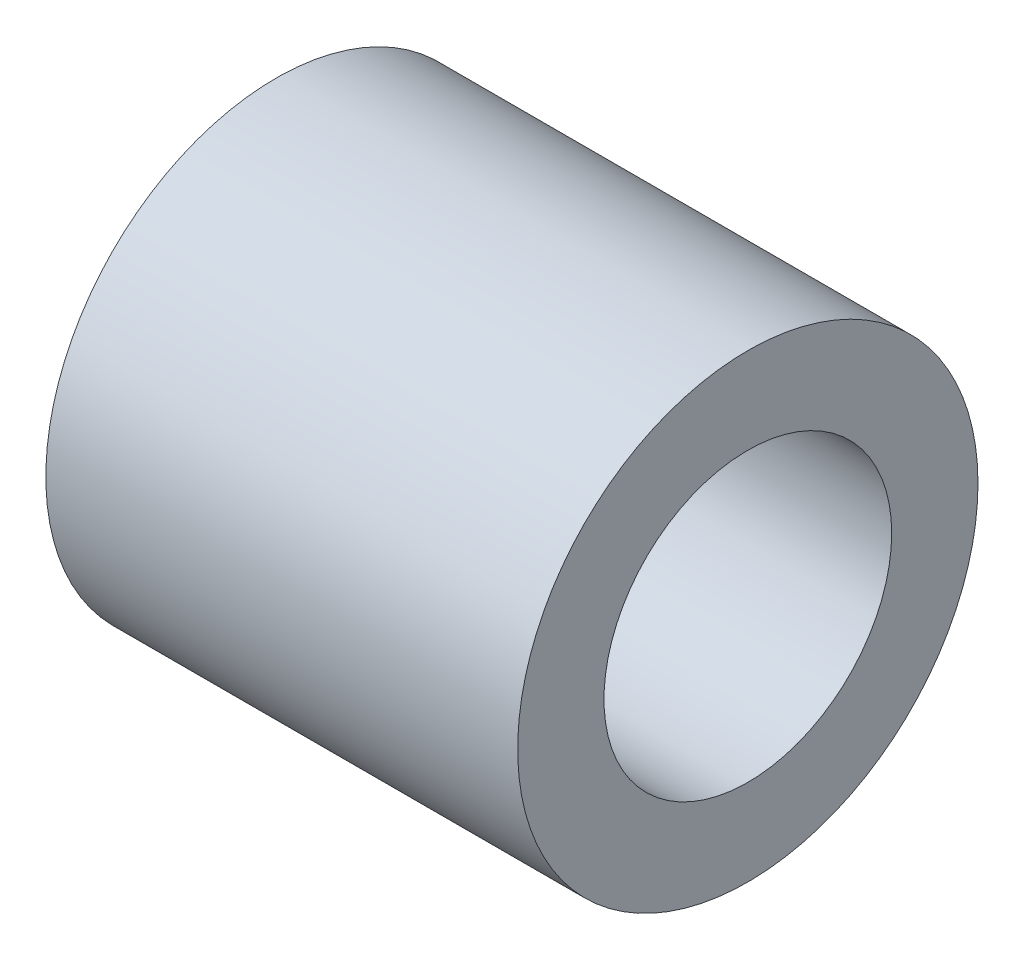
ISO-10303-21;
HEADER;
FILE_DESCRIPTION(('STEP AP214'),'2;1');
FILE_NAME('part.step','',(''),(''),'','','');
FILE_SCHEMA(('AUTOMOTIVE_DESIGN { 1 0 10303 214 1 1 1 1 }'));
ENDSEC;
DATA;
#1=APPLICATION_CONTEXT('core data for automotive mechanical design processes');
#2=APPLICATION_PROTOCOL_DEFINITION('international standard','automotive_design',2000,#1);
#3=PRODUCT_CONTEXT('',#1,'mechanical');
#4=PRODUCT('Part','Part','',(#3));
#5=PRODUCT_RELATED_PRODUCT_CATEGORY('part','',(#4));
#6=PRODUCT_DEFINITION_FORMATION('','',#4);
#7=PRODUCT_DEFINITION_CONTEXT('part definition',#1,'design');
#8=PRODUCT_DEFINITION('design','',#6,#7);
#9=PRODUCT_DEFINITION_SHAPE('','',#8);
#10=(LENGTH_UNIT() NAMED_UNIT(*) SI_UNIT(.MILLI.,.METRE.));
#11=(NAMED_UNIT(*) PLANE_ANGLE_UNIT() SI_UNIT($,.RADIAN.));
#12=(NAMED_UNIT(*) SI_UNIT($,.STERADIAN.) SOLID_ANGLE_UNIT());
#13=UNCERTAINTY_MEASURE_WITH_UNIT(LENGTH_MEASURE(1.E-05),#10,'distance_accuracy_value','');
#14=(GEOMETRIC_REPRESENTATION_CONTEXT(3) GLOBAL_UNCERTAINTY_ASSIGNED_CONTEXT((#13)) GLOBAL_UNIT_ASSIGNED_CONTEXT((#10,
#11,#12)) REPRESENTATION_CONTEXT('',''));
#15=CARTESIAN_POINT('',(0.,0.,0.));
#16=DIRECTION('',(0.,0.,1.));
#17=DIRECTION('',(1.,0.,0.));
#18=AXIS2_PLACEMENT_3D('',#15,#16,#17);
#19=CARTESIAN_POINT('',(8.2,0.,0.));
#20=DIRECTION('',(-1.,0.,0.));
#21=DIRECTION('',(0.,0.,1.));
#22=AXIS2_PLACEMENT_3D('',#19,#20,#21);
#23=CYLINDRICAL_SURFACE('',#22,2.5);
#24=CARTESIAN_POINT('',(8.2,0.,0.));
#25=DIRECTION('',(1.,0.,0.));
#26=DIRECTION('',(0.,0.,-1.));
#27=AXIS2_PLACEMENT_3D('',#24,#25,#26);
#28=CIRCLE('',#27,2.5);
#29=CARTESIAN_POINT('',(8.2,0.,-2.5));
#30=VERTEX_POINT('',#29);
#31=EDGE_CURVE('E45',#30,#30,#28,.T.);
#32=ORIENTED_EDGE('',*,*,#31,.T.);
#33=EDGE_LOOP('',(#32));
#34=FACE_BOUND('',#33,.T.);
#35=CARTESIAN_POINT('',(0.,0.,0.));
#36=DIRECTION('',(1.,0.,0.));
#37=DIRECTION('',(0.,0.,-1.));
#38=AXIS2_PLACEMENT_3D('',#35,#36,#37);
#39=CIRCLE('',#38,2.5);
#40=CARTESIAN_POINT('',(0.,0.,-2.5));
#41=VERTEX_POINT('',#40);
#42=EDGE_CURVE('E52',#41,#41,#39,.T.);
#43=ORIENTED_EDGE('',*,*,#42,.F.);
#44=EDGE_LOOP('',(#43));
#45=FACE_BOUND('',#44,.T.);
#46=ADVANCED_FACE('F37',(#34,#45),#23,.F.);
#47=CARTESIAN_POINT('',(8.2,0.,0.));
#48=DIRECTION('',(-1.,0.,0.));
#49=DIRECTION('',(0.,0.,1.));
#50=AXIS2_PLACEMENT_3D('',#47,#48,#49);
#51=CYLINDRICAL_SURFACE('',#50,4.);
#52=CARTESIAN_POINT('',(8.2,0.,0.));
#53=DIRECTION('',(1.,0.,0.));
#54=DIRECTION('',(0.,0.,-1.));
#55=AXIS2_PLACEMENT_3D('',#52,#53,#54);
#56=CIRCLE('',#55,4.);
#57=CARTESIAN_POINT('',(8.2,0.,-4.));
#58=VERTEX_POINT('',#57);
#59=EDGE_CURVE('E10',#58,#58,#56,.T.);
#60=ORIENTED_EDGE('',*,*,#59,.F.);
#61=EDGE_LOOP('',(#60));
#62=FACE_BOUND('',#61,.T.);
#63=CARTESIAN_POINT('',(0.,0.,0.));
#64=DIRECTION('',(1.,0.,0.));
#65=DIRECTION('',(0.,0.,-1.));
#66=AXIS2_PLACEMENT_3D('',#63,#64,#65);
#67=CIRCLE('',#66,4.);
#68=CARTESIAN_POINT('',(0.,0.,-4.));
#69=VERTEX_POINT('',#68);
#70=EDGE_CURVE('E40',#69,#69,#67,.T.);
#71=ORIENTED_EDGE('',*,*,#70,.T.);
#72=EDGE_LOOP('',(#71));
#73=FACE_BOUND('',#72,.T.);
#74=ADVANCED_FACE('F61',(#62,#73),#51,.T.);
#75=CARTESIAN_POINT('',(8.2,0.,0.));
#76=DIRECTION('',(1.,0.,0.));
#77=DIRECTION('',(0.,0.,-1.));
#78=AXIS2_PLACEMENT_3D('',#75,#76,#77);
#79=PLANE('',#78);
#80=ORIENTED_EDGE('',*,*,#31,.F.);
#81=EDGE_LOOP('',(#80));
#82=FACE_BOUND('',#81,.T.);
#83=ORIENTED_EDGE('',*,*,#59,.T.);
#84=EDGE_LOOP('',(#83));
#85=FACE_BOUND('',#84,.T.);
#86=ADVANCED_FACE('F65',(#82,#85),#79,.T.);
#87=CARTESIAN_POINT('',(0.,0.,0.));
#88=DIRECTION('',(1.,0.,0.));
#89=DIRECTION('',(0.,0.,-1.));
#90=AXIS2_PLACEMENT_3D('',#87,#88,#89);
#91=PLANE('',#90);
#92=ORIENTED_EDGE('',*,*,#42,.T.);
#93=EDGE_LOOP('',(#92));
#94=FACE_BOUND('',#93,.T.);
#95=ORIENTED_EDGE('',*,*,#70,.F.);
#96=EDGE_LOOP('',(#95));
#97=FACE_BOUND('',#96,.T.);
#98=ADVANCED_FACE('F63',(#94,#97),#91,.F.);
#99=CLOSED_SHELL('',(#46,#74,#86,#98));
#100=MANIFOLD_SOLID_BREP('B2',#99);
#101=ADVANCED_BREP_SHAPE_REPRESENTATION('',(#18,#100),#14);
#102=SHAPE_DEFINITION_REPRESENTATION(#9,#101);
ENDSEC;
END-ISO-10303-21;
